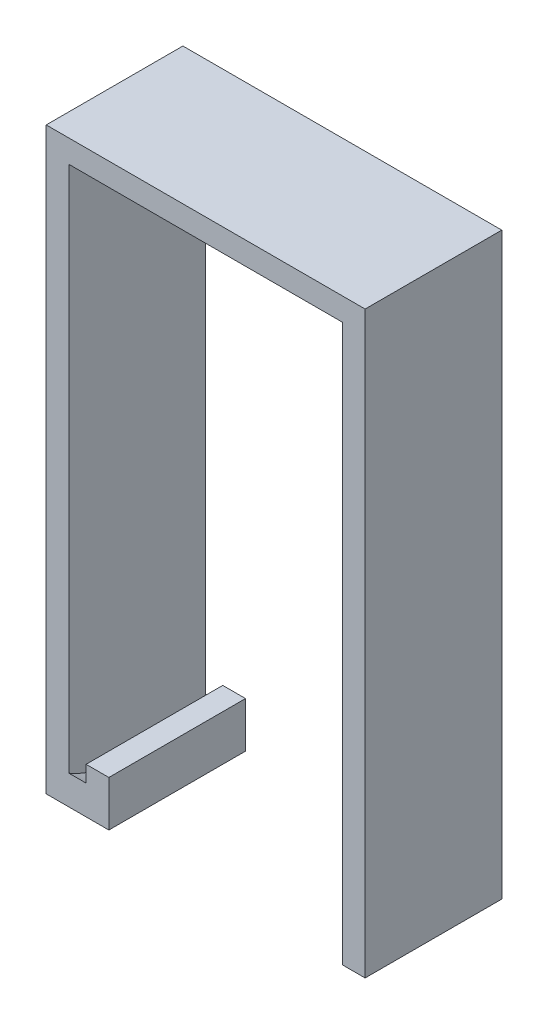
ISO-10303-21;
HEADER;
FILE_DESCRIPTION(('STEP AP214'),'2;1');
FILE_NAME('part.step','',(''),(''),'','','');
FILE_SCHEMA(('AUTOMOTIVE_DESIGN { 1 0 10303 214 1 1 1 1 }'));
ENDSEC;
DATA;
#1=APPLICATION_CONTEXT('core data for automotive mechanical design processes');
#2=APPLICATION_PROTOCOL_DEFINITION('international standard','automotive_design',2000,#1);
#3=PRODUCT_CONTEXT('',#1,'mechanical');
#4=PRODUCT('Part','Part','',(#3));
#5=PRODUCT_RELATED_PRODUCT_CATEGORY('part','',(#4));
#6=PRODUCT_DEFINITION_FORMATION('','',#4);
#7=PRODUCT_DEFINITION_CONTEXT('part definition',#1,'design');
#8=PRODUCT_DEFINITION('design','',#6,#7);
#9=PRODUCT_DEFINITION_SHAPE('','',#8);
#10=(LENGTH_UNIT() NAMED_UNIT(*) SI_UNIT(.MILLI.,.METRE.));
#11=(NAMED_UNIT(*) PLANE_ANGLE_UNIT() SI_UNIT($,.RADIAN.));
#12=(NAMED_UNIT(*) SI_UNIT($,.STERADIAN.) SOLID_ANGLE_UNIT());
#13=UNCERTAINTY_MEASURE_WITH_UNIT(LENGTH_MEASURE(1.E-05),#10,'distance_accuracy_value','');
#14=(GEOMETRIC_REPRESENTATION_CONTEXT(3) GLOBAL_UNCERTAINTY_ASSIGNED_CONTEXT((#13)) GLOBAL_UNIT_ASSIGNED_CONTEXT((#10,
#11,#12)) REPRESENTATION_CONTEXT('',''));
#15=CARTESIAN_POINT('',(0.,0.,0.));
#16=DIRECTION('',(0.,0.,1.));
#17=DIRECTION('',(1.,0.,0.));
#18=AXIS2_PLACEMENT_3D('',#15,#16,#17);
#19=CARTESIAN_POINT('',(-12.,0.,0.));
#20=DIRECTION('',(-1.,0.,0.));
#21=DIRECTION('',(0.,0.,1.));
#22=AXIS2_PLACEMENT_3D('',#19,#20,#21);
#23=PLANE('',#22);
#24=CARTESIAN_POINT('',(-12.,-36.62,0.));
#25=DIRECTION('',(-1.,0.,0.));
#26=DIRECTION('',(0.,0.,-1.));
#27=AXIS2_PLACEMENT_3D('',#24,#25,#26);
#28=CIRCLE('',#27,12.25);
#29=CARTESIAN_POINT('',(-12.,-47.3000046816469,-5.99999999999999));
#30=VERTEX_POINT('',#29);
#31=CARTESIAN_POINT('',(-12.,-47.3000046816469,6.00000000000001));
#32=VERTEX_POINT('',#31);
#33=EDGE_CURVE('E163',#30,#32,#28,.T.);
#34=ORIENTED_EDGE('',*,*,#33,.F.);
#35=DIRECTION('',(0.,-1.,0.));
#36=VECTOR('',#35,1.);
#37=CARTESIAN_POINT('',(-12.,1.,-6.));
#38=LINE('',#37,#36);
#39=CARTESIAN_POINT('',(-12.,-1.,-6.));
#40=VERTEX_POINT('',#39);
#41=EDGE_CURVE('E198',#40,#30,#38,.T.);
#42=ORIENTED_EDGE('',*,*,#41,.F.);
#43=DIRECTION('',(0.,0.,1.));
#44=VECTOR('',#43,1.);
#45=CARTESIAN_POINT('',(-12.,-1.,-6.));
#46=LINE('',#45,#44);
#47=CARTESIAN_POINT('',(-12.,-1.,6.));
#48=VERTEX_POINT('',#47);
#49=EDGE_CURVE('E211',#40,#48,#46,.T.);
#50=ORIENTED_EDGE('',*,*,#49,.T.);
#51=DIRECTION('',(0.,1.,0.));
#52=VECTOR('',#51,1.);
#53=CARTESIAN_POINT('',(-12.,1.,6.));
#54=LINE('',#53,#52);
#55=EDGE_CURVE('E203',#32,#48,#54,.T.);
#56=ORIENTED_EDGE('',*,*,#55,.F.);
#57=EDGE_LOOP('',(#34,#42,#50,#56));
#58=FACE_BOUND('',#57,.T.);
#59=ADVANCED_FACE('F33',(#58),#23,.F.);
#60=CARTESIAN_POINT('',(-12.,1.,6.));
#61=DIRECTION('',(0.,0.,-1.));
#62=DIRECTION('',(-1.,0.,0.));
#63=AXIS2_PLACEMENT_3D('',#60,#61,#62);
#64=PLANE('',#63);
#65=DIRECTION('',(1.,0.,0.));
#66=VECTOR('',#65,1.);
#67=CARTESIAN_POINT('',(-12.,-1.,6.));
#68=LINE('',#67,#66);
#69=CARTESIAN_POINT('',(12.,-1.,6.));
#70=VERTEX_POINT('',#69);
#71=EDGE_CURVE('E57',#48,#70,#68,.T.);
#72=ORIENTED_EDGE('',*,*,#71,.T.);
#73=DIRECTION('',(0.,1.,0.));
#74=VECTOR('',#73,1.);
#75=CARTESIAN_POINT('',(12.,1.,6.));
#76=LINE('',#75,#74);
#77=CARTESIAN_POINT('',(12.,-49.87,6.00000000000001));
#78=VERTEX_POINT('',#77);
#79=EDGE_CURVE('E189',#78,#70,#76,.T.);
#80=ORIENTED_EDGE('',*,*,#79,.F.);
#81=DIRECTION('',(-1.,0.,0.));
#82=VECTOR('',#81,1.);
#83=CARTESIAN_POINT('',(14.,-49.87,6.00000000000001));
#84=LINE('',#83,#82);
#85=CARTESIAN_POINT('',(14.,-49.87,6.00000000000001));
#86=VERTEX_POINT('',#85);
#87=EDGE_CURVE('E196',#86,#78,#84,.T.);
#88=ORIENTED_EDGE('',*,*,#87,.F.);
#89=DIRECTION('',(0.,1.,0.));
#90=VECTOR('',#89,1.);
#91=CARTESIAN_POINT('',(14.,1.,6.));
#92=LINE('',#91,#90);
#93=CARTESIAN_POINT('',(14.,1.,6.));
#94=VERTEX_POINT('',#93);
#95=EDGE_CURVE('E181',#86,#94,#92,.T.);
#96=ORIENTED_EDGE('',*,*,#95,.T.);
#97=DIRECTION('',(1.,0.,0.));
#98=VECTOR('',#97,1.);
#99=CARTESIAN_POINT('',(-12.,1.,6.));
#100=LINE('',#99,#98);
#101=CARTESIAN_POINT('',(-14.,1.,6.));
#102=VERTEX_POINT('',#101);
#103=EDGE_CURVE('E42',#102,#94,#100,.T.);
#104=ORIENTED_EDGE('',*,*,#103,.F.);
#105=DIRECTION('',(0.,1.,0.));
#106=VECTOR('',#105,1.);
#107=CARTESIAN_POINT('',(-14.,1.,6.));
#108=LINE('',#107,#106);
#109=CARTESIAN_POINT('',(-14.,-49.87,6.00000000000001));
#110=VERTEX_POINT('',#109);
#111=EDGE_CURVE('E130',#110,#102,#108,.T.);
#112=ORIENTED_EDGE('',*,*,#111,.F.);
#113=DIRECTION('',(1.,0.,0.));
#114=VECTOR('',#113,1.);
#115=CARTESIAN_POINT('',(-14.,-49.87,6.00000000000001));
#116=LINE('',#115,#114);
#117=CARTESIAN_POINT('',(-8.5,-49.87,6.00000000000001));
#118=VERTEX_POINT('',#117);
#119=EDGE_CURVE('E124',#110,#118,#116,.T.);
#120=ORIENTED_EDGE('',*,*,#119,.T.);
#121=DIRECTION('',(0.,-1.,0.));
#122=VECTOR('',#121,1.);
#123=CARTESIAN_POINT('',(-8.5,-49.87,6.00000000000001));
#124=LINE('',#123,#122);
#125=CARTESIAN_POINT('',(-8.5,-45.87,6.00000000000001));
#126=VERTEX_POINT('',#125);
#127=EDGE_CURVE('E128',#126,#118,#124,.T.);
#128=ORIENTED_EDGE('',*,*,#127,.F.);
#129=DIRECTION('',(-1.,0.,0.));
#130=VECTOR('',#129,1.);
#131=CARTESIAN_POINT('',(-8.5,-45.87,6.00000000000001));
#132=LINE('',#131,#130);
#133=CARTESIAN_POINT('',(-10.5,-45.87,6.00000000000001));
#134=VERTEX_POINT('',#133);
#135=EDGE_CURVE('E154',#126,#134,#132,.T.);
#136=ORIENTED_EDGE('',*,*,#135,.T.);
#137=DIRECTION('',(0.,-1.,0.));
#138=VECTOR('',#137,1.);
#139=CARTESIAN_POINT('',(-10.5,-49.87,6.00000000000001));
#140=LINE('',#139,#138);
#141=CARTESIAN_POINT('',(-10.5,-47.3000046816469,6.00000000000001));
#142=VERTEX_POINT('',#141);
#143=EDGE_CURVE('E155',#134,#142,#140,.T.);
#144=ORIENTED_EDGE('',*,*,#143,.T.);
#145=DIRECTION('',(-1.,0.,0.));
#146=VECTOR('',#145,1.);
#147=CARTESIAN_POINT('',(-10.5,-47.3000046816469,6.00000000000001));
#148=LINE('',#147,#146);
#149=EDGE_CURVE('E167',#142,#32,#148,.T.);
#150=ORIENTED_EDGE('',*,*,#149,.T.);
#151=ORIENTED_EDGE('',*,*,#55,.T.);
#152=EDGE_LOOP('',(#72,#80,#88,#96,#104,#112,#120,#128,#136,#144,#150,#151));
#153=FACE_BOUND('',#152,.T.);
#154=ADVANCED_FACE('F35',(#153),#64,.F.);
#155=CARTESIAN_POINT('',(-12.,1.,-6.));
#156=DIRECTION('',(0.,0.,1.));
#157=DIRECTION('',(1.,0.,0.));
#158=AXIS2_PLACEMENT_3D('',#155,#156,#157);
#159=PLANE('',#158);
#160=DIRECTION('',(-1.,0.,0.));
#161=VECTOR('',#160,1.);
#162=CARTESIAN_POINT('',(-12.,-1.,-6.));
#163=LINE('',#162,#161);
#164=CARTESIAN_POINT('',(12.,-1.,-6.));
#165=VERTEX_POINT('',#164);
#166=EDGE_CURVE('E37',#165,#40,#163,.T.);
#167=ORIENTED_EDGE('',*,*,#166,.T.);
#168=ORIENTED_EDGE('',*,*,#41,.T.);
#169=DIRECTION('',(-1.,0.,0.));
#170=VECTOR('',#169,1.);
#171=CARTESIAN_POINT('',(-10.5,-47.3000046816469,-5.99999999999999));
#172=LINE('',#171,#170);
#173=CARTESIAN_POINT('',(-10.5,-47.3000046816469,-6.));
#174=VERTEX_POINT('',#173);
#175=EDGE_CURVE('E171',#174,#30,#172,.T.);
#176=ORIENTED_EDGE('',*,*,#175,.F.);
#177=DIRECTION('',(0.,1.,0.));
#178=VECTOR('',#177,1.);
#179=CARTESIAN_POINT('',(-10.5,-49.87,-5.99999999999999));
#180=LINE('',#179,#178);
#181=CARTESIAN_POINT('',(-10.5,-45.87,-6.));
#182=VERTEX_POINT('',#181);
#183=EDGE_CURVE('E149',#174,#182,#180,.T.);
#184=ORIENTED_EDGE('',*,*,#183,.T.);
#185=DIRECTION('',(-1.,0.,0.));
#186=VECTOR('',#185,1.);
#187=CARTESIAN_POINT('',(-8.5,-45.87,-6.));
#188=LINE('',#187,#186);
#189=CARTESIAN_POINT('',(-8.5,-45.87,-6.));
#190=VERTEX_POINT('',#189);
#191=EDGE_CURVE('E160',#190,#182,#188,.T.);
#192=ORIENTED_EDGE('',*,*,#191,.F.);
#193=DIRECTION('',(0.,1.,0.));
#194=VECTOR('',#193,1.);
#195=CARTESIAN_POINT('',(-8.5,-49.87,-5.99999999999999));
#196=LINE('',#195,#194);
#197=CARTESIAN_POINT('',(-8.5,-49.87,-5.99999999999999));
#198=VERTEX_POINT('',#197);
#199=EDGE_CURVE('E141',#198,#190,#196,.T.);
#200=ORIENTED_EDGE('',*,*,#199,.F.);
#201=DIRECTION('',(1.,0.,0.));
#202=VECTOR('',#201,1.);
#203=CARTESIAN_POINT('',(-14.,-49.87,-5.99999999999999));
#204=LINE('',#203,#202);
#205=CARTESIAN_POINT('',(-14.,-49.87,-5.99999999999999));
#206=VERTEX_POINT('',#205);
#207=EDGE_CURVE('E132',#206,#198,#204,.T.);
#208=ORIENTED_EDGE('',*,*,#207,.F.);
#209=DIRECTION('',(0.,-1.,0.));
#210=VECTOR('',#209,1.);
#211=CARTESIAN_POINT('',(-14.,1.,-6.));
#212=LINE('',#211,#210);
#213=CARTESIAN_POINT('',(-14.,1.,-6.));
#214=VERTEX_POINT('',#213);
#215=EDGE_CURVE('E199',#214,#206,#212,.T.);
#216=ORIENTED_EDGE('',*,*,#215,.F.);
#217=DIRECTION('',(-1.,0.,0.));
#218=VECTOR('',#217,1.);
#219=CARTESIAN_POINT('',(-12.,1.,-6.));
#220=LINE('',#219,#218);
#221=CARTESIAN_POINT('',(14.,1.,-6.));
#222=VERTEX_POINT('',#221);
#223=EDGE_CURVE('E11',#222,#214,#220,.T.);
#224=ORIENTED_EDGE('',*,*,#223,.F.);
#225=DIRECTION('',(0.,-1.,0.));
#226=VECTOR('',#225,1.);
#227=CARTESIAN_POINT('',(14.,1.,-6.));
#228=LINE('',#227,#226);
#229=CARTESIAN_POINT('',(14.,-49.87,-5.99999999999999));
#230=VERTEX_POINT('',#229);
#231=EDGE_CURVE('E174',#222,#230,#228,.T.);
#232=ORIENTED_EDGE('',*,*,#231,.T.);
#233=DIRECTION('',(-1.,0.,0.));
#234=VECTOR('',#233,1.);
#235=CARTESIAN_POINT('',(14.,-49.87,-5.99999999999999));
#236=LINE('',#235,#234);
#237=CARTESIAN_POINT('',(12.,-49.87,-5.99999999999999));
#238=VERTEX_POINT('',#237);
#239=EDGE_CURVE('E187',#230,#238,#236,.T.);
#240=ORIENTED_EDGE('',*,*,#239,.T.);
#241=DIRECTION('',(0.,-1.,0.));
#242=VECTOR('',#241,1.);
#243=CARTESIAN_POINT('',(12.,1.,-6.));
#244=LINE('',#243,#242);
#245=EDGE_CURVE('E173',#165,#238,#244,.T.);
#246=ORIENTED_EDGE('',*,*,#245,.F.);
#247=EDGE_LOOP('',(#167,#168,#176,#184,#192,#200,#208,#216,#224,#232,#240,#246));
#248=FACE_BOUND('',#247,.T.);
#249=ADVANCED_FACE('F220',(#248),#159,.F.);
#250=CARTESIAN_POINT('',(0.,1.,0.));
#251=DIRECTION('',(0.,1.,0.));
#252=DIRECTION('',(0.,0.,1.));
#253=AXIS2_PLACEMENT_3D('',#250,#251,#252);
#254=PLANE('',#253);
#255=ORIENTED_EDGE('',*,*,#223,.T.);
#256=DIRECTION('',(0.,0.,-1.));
#257=VECTOR('',#256,1.);
#258=CARTESIAN_POINT('',(-14.,1.,-6.));
#259=LINE('',#258,#257);
#260=EDGE_CURVE('E133',#102,#214,#259,.T.);
#261=ORIENTED_EDGE('',*,*,#260,.F.);
#262=ORIENTED_EDGE('',*,*,#103,.T.);
#263=DIRECTION('',(0.,0.,-1.));
#264=VECTOR('',#263,1.);
#265=CARTESIAN_POINT('',(14.,1.,-6.));
#266=LINE('',#265,#264);
#267=EDGE_CURVE('E177',#94,#222,#266,.T.);
#268=ORIENTED_EDGE('',*,*,#267,.T.);
#269=EDGE_LOOP('',(#255,#261,#262,#268));
#270=FACE_BOUND('',#269,.T.);
#271=ADVANCED_FACE('F231',(#270),#254,.T.);
#272=CARTESIAN_POINT('',(0.,-1.,0.));
#273=DIRECTION('',(0.,1.,0.));
#274=DIRECTION('',(0.,0.,1.));
#275=AXIS2_PLACEMENT_3D('',#272,#273,#274);
#276=PLANE('',#275);
#277=ORIENTED_EDGE('',*,*,#49,.F.);
#278=ORIENTED_EDGE('',*,*,#166,.F.);
#279=DIRECTION('',(0.,0.,-1.));
#280=VECTOR('',#279,1.);
#281=CARTESIAN_POINT('',(12.,-1.,-6.));
#282=LINE('',#281,#280);
#283=EDGE_CURVE('E215',#70,#165,#282,.T.);
#284=ORIENTED_EDGE('',*,*,#283,.F.);
#285=ORIENTED_EDGE('',*,*,#71,.F.);
#286=EDGE_LOOP('',(#277,#278,#284,#285));
#287=FACE_BOUND('',#286,.T.);
#288=ADVANCED_FACE('F251',(#287),#276,.F.);
#289=CARTESIAN_POINT('',(-14.,-49.87,-5.99999999999999));
#290=DIRECTION('',(0.,1.,0.));
#291=DIRECTION('',(0.,0.,1.));
#292=AXIS2_PLACEMENT_3D('',#289,#290,#291);
#293=PLANE('',#292);
#294=ORIENTED_EDGE('',*,*,#207,.T.);
#295=DIRECTION('',(0.,0.,-1.));
#296=VECTOR('',#295,1.);
#297=CARTESIAN_POINT('',(-8.5,-49.87,6.00000000000001));
#298=LINE('',#297,#296);
#299=EDGE_CURVE('E136',#118,#198,#298,.T.);
#300=ORIENTED_EDGE('',*,*,#299,.F.);
#301=ORIENTED_EDGE('',*,*,#119,.F.);
#302=DIRECTION('',(0.,0.,1.));
#303=VECTOR('',#302,1.);
#304=CARTESIAN_POINT('',(-14.,-49.87,-5.99999999999999));
#305=LINE('',#304,#303);
#306=EDGE_CURVE('E202',#206,#110,#305,.T.);
#307=ORIENTED_EDGE('',*,*,#306,.F.);
#308=EDGE_LOOP('',(#294,#300,#301,#307));
#309=FACE_BOUND('',#308,.T.);
#310=ADVANCED_FACE('F137',(#309),#293,.F.);
#311=CARTESIAN_POINT('',(-14.,0.,0.));
#312=DIRECTION('',(-1.,0.,0.));
#313=DIRECTION('',(0.,0.,1.));
#314=AXIS2_PLACEMENT_3D('',#311,#312,#313);
#315=PLANE('',#314);
#316=ORIENTED_EDGE('',*,*,#215,.T.);
#317=ORIENTED_EDGE('',*,*,#306,.T.);
#318=ORIENTED_EDGE('',*,*,#111,.T.);
#319=ORIENTED_EDGE('',*,*,#260,.T.);
#320=EDGE_LOOP('',(#316,#317,#318,#319));
#321=FACE_BOUND('',#320,.T.);
#322=ADVANCED_FACE('F234',(#321),#315,.T.);
#323=CARTESIAN_POINT('',(12.,0.,0.));
#324=DIRECTION('',(1.,0.,0.));
#325=DIRECTION('',(0.,0.,1.));
#326=AXIS2_PLACEMENT_3D('',#323,#324,#325);
#327=PLANE('',#326);
#328=ORIENTED_EDGE('',*,*,#79,.T.);
#329=ORIENTED_EDGE('',*,*,#283,.T.);
#330=ORIENTED_EDGE('',*,*,#245,.T.);
#331=DIRECTION('',(0.,0.,1.));
#332=VECTOR('',#331,1.);
#333=CARTESIAN_POINT('',(12.,-49.87,-5.99999999999999));
#334=LINE('',#333,#332);
#335=EDGE_CURVE('E178',#238,#78,#334,.T.);
#336=ORIENTED_EDGE('',*,*,#335,.T.);
#337=EDGE_LOOP('',(#328,#329,#330,#336));
#338=FACE_BOUND('',#337,.T.);
#339=ADVANCED_FACE('F218',(#338),#327,.F.);
#340=CARTESIAN_POINT('',(14.,-49.87,-5.99999999999999));
#341=DIRECTION('',(0.,-1.,0.));
#342=DIRECTION('',(0.,0.,-1.));
#343=AXIS2_PLACEMENT_3D('',#340,#341,#342);
#344=PLANE('',#343);
#345=ORIENTED_EDGE('',*,*,#335,.F.);
#346=ORIENTED_EDGE('',*,*,#239,.F.);
#347=DIRECTION('',(0.,0.,1.));
#348=VECTOR('',#347,1.);
#349=CARTESIAN_POINT('',(14.,-49.87,-5.99999999999999));
#350=LINE('',#349,#348);
#351=EDGE_CURVE('E184',#230,#86,#350,.T.);
#352=ORIENTED_EDGE('',*,*,#351,.T.);
#353=ORIENTED_EDGE('',*,*,#87,.T.);
#354=EDGE_LOOP('',(#345,#346,#352,#353));
#355=FACE_BOUND('',#354,.T.);
#356=ADVANCED_FACE('F225',(#355),#344,.T.);
#357=CARTESIAN_POINT('',(14.,0.,0.));
#358=DIRECTION('',(1.,0.,0.));
#359=DIRECTION('',(0.,0.,1.));
#360=AXIS2_PLACEMENT_3D('',#357,#358,#359);
#361=PLANE('',#360);
#362=ORIENTED_EDGE('',*,*,#231,.F.);
#363=ORIENTED_EDGE('',*,*,#267,.F.);
#364=ORIENTED_EDGE('',*,*,#95,.F.);
#365=ORIENTED_EDGE('',*,*,#351,.F.);
#366=EDGE_LOOP('',(#362,#363,#364,#365));
#367=FACE_BOUND('',#366,.T.);
#368=ADVANCED_FACE('F229',(#367),#361,.T.);
#369=CARTESIAN_POINT('',(-10.5,-36.62,0.));
#370=DIRECTION('',(-1.,0.,0.));
#371=DIRECTION('',(0.,0.,1.));
#372=AXIS2_PLACEMENT_3D('',#369,#370,#371);
#373=CYLINDRICAL_SURFACE('',#372,12.25);
#374=ORIENTED_EDGE('',*,*,#33,.T.);
#375=ORIENTED_EDGE('',*,*,#149,.F.);
#376=CARTESIAN_POINT('',(-10.5,-36.62,0.));
#377=DIRECTION('',(-1.,0.,0.));
#378=DIRECTION('',(0.,0.,-1.));
#379=AXIS2_PLACEMENT_3D('',#376,#377,#378);
#380=CIRCLE('',#379,12.25);
#381=EDGE_CURVE('E164',#174,#142,#380,.T.);
#382=ORIENTED_EDGE('',*,*,#381,.F.);
#383=ORIENTED_EDGE('',*,*,#175,.T.);
#384=EDGE_LOOP('',(#374,#375,#382,#383));
#385=FACE_BOUND('',#384,.T.);
#386=ADVANCED_FACE('F246',(#385),#373,.F.);
#387=CARTESIAN_POINT('',(-10.5,0.,0.));
#388=DIRECTION('',(-1.,0.,0.));
#389=DIRECTION('',(0.,0.,1.));
#390=AXIS2_PLACEMENT_3D('',#387,#388,#389);
#391=PLANE('',#390);
#392=ORIENTED_EDGE('',*,*,#381,.T.);
#393=ORIENTED_EDGE('',*,*,#143,.F.);
#394=DIRECTION('',(0.,0.,1.));
#395=VECTOR('',#394,1.);
#396=CARTESIAN_POINT('',(-10.5,-45.87,6.00000000000001));
#397=LINE('',#396,#395);
#398=EDGE_CURVE('E147',#182,#134,#397,.T.);
#399=ORIENTED_EDGE('',*,*,#398,.F.);
#400=ORIENTED_EDGE('',*,*,#183,.F.);
#401=EDGE_LOOP('',(#392,#393,#399,#400));
#402=FACE_BOUND('',#401,.T.);
#403=ADVANCED_FACE('F244',(#402),#391,.T.);
#404=CARTESIAN_POINT('',(-8.5,-45.87,6.00000000000001));
#405=DIRECTION('',(0.,-1.,0.));
#406=DIRECTION('',(0.,0.,-1.));
#407=AXIS2_PLACEMENT_3D('',#404,#405,#406);
#408=PLANE('',#407);
#409=ORIENTED_EDGE('',*,*,#398,.T.);
#410=ORIENTED_EDGE('',*,*,#135,.F.);
#411=DIRECTION('',(0.,0.,1.));
#412=VECTOR('',#411,1.);
#413=CARTESIAN_POINT('',(-8.5,-45.87,6.00000000000001));
#414=LINE('',#413,#412);
#415=EDGE_CURVE('E145',#190,#126,#414,.T.);
#416=ORIENTED_EDGE('',*,*,#415,.F.);
#417=ORIENTED_EDGE('',*,*,#191,.T.);
#418=EDGE_LOOP('',(#409,#410,#416,#417));
#419=FACE_BOUND('',#418,.T.);
#420=ADVANCED_FACE('F241',(#419),#408,.F.);
#421=CARTESIAN_POINT('',(-8.5,0.,0.));
#422=DIRECTION('',(-1.,0.,0.));
#423=DIRECTION('',(0.,0.,1.));
#424=AXIS2_PLACEMENT_3D('',#421,#422,#423);
#425=PLANE('',#424);
#426=ORIENTED_EDGE('',*,*,#127,.T.);
#427=ORIENTED_EDGE('',*,*,#299,.T.);
#428=ORIENTED_EDGE('',*,*,#199,.T.);
#429=ORIENTED_EDGE('',*,*,#415,.T.);
#430=EDGE_LOOP('',(#426,#427,#428,#429));
#431=FACE_BOUND('',#430,.T.);
#432=ADVANCED_FACE('F143',(#431),#425,.F.);
#433=CLOSED_SHELL('',(#59,#154,#249,#271,#288,#310,#322,#339,#356,#368,#386,#403,#420,#432));
#434=MANIFOLD_SOLID_BREP('B2',#433);
#435=ADVANCED_BREP_SHAPE_REPRESENTATION('',(#18,#434),#14);
#436=SHAPE_DEFINITION_REPRESENTATION(#9,#435);
ENDSEC;
END-ISO-10303-21;
